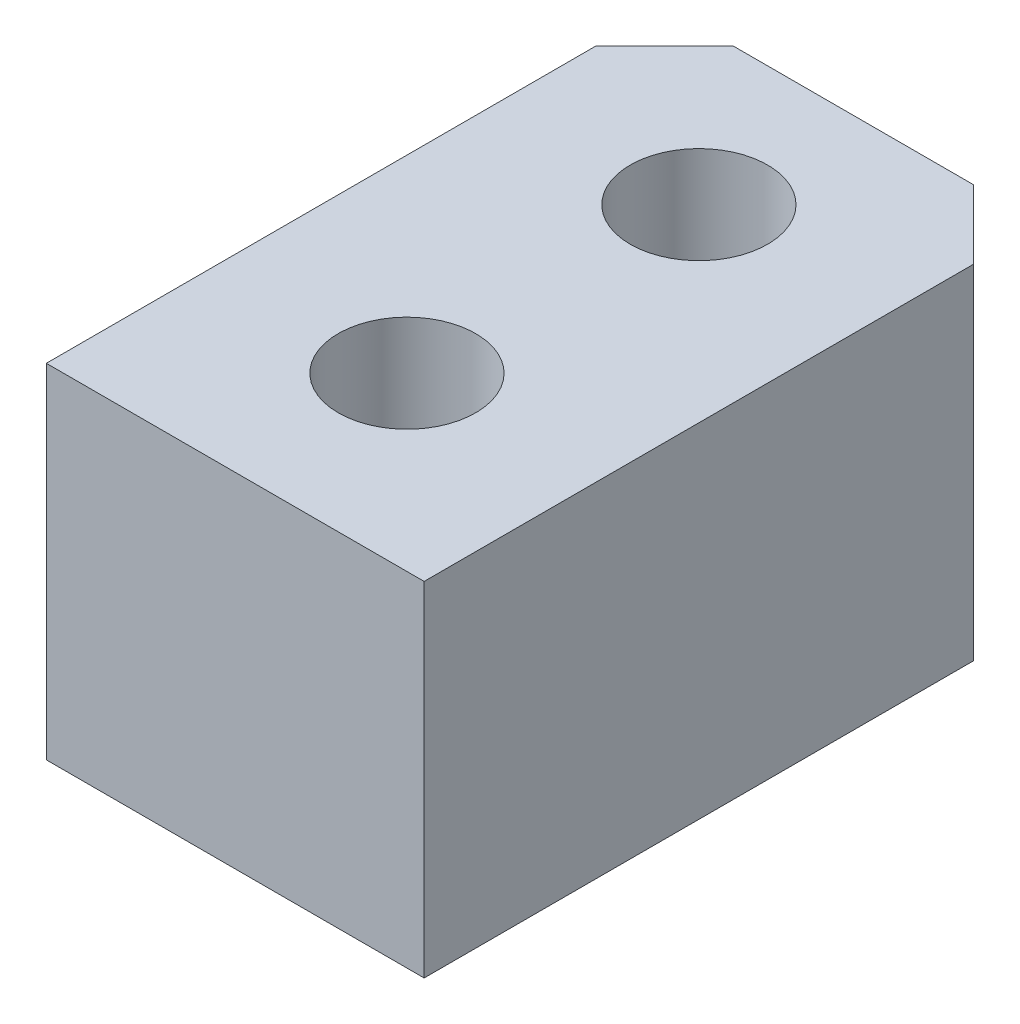
ISO-10303-21;
HEADER;
FILE_DESCRIPTION(('STEP AP214'),'2;1');
FILE_NAME('part.step','',(''),(''),'','','');
FILE_SCHEMA(('AUTOMOTIVE_DESIGN { 1 0 10303 214 1 1 1 1 }'));
ENDSEC;
DATA;
#1=APPLICATION_CONTEXT('core data for automotive mechanical design processes');
#2=APPLICATION_PROTOCOL_DEFINITION('international standard','automotive_design',2000,#1);
#3=PRODUCT_CONTEXT('',#1,'mechanical');
#4=PRODUCT('Part','Part','',(#3));
#5=PRODUCT_RELATED_PRODUCT_CATEGORY('part','',(#4));
#6=PRODUCT_DEFINITION_FORMATION('','',#4);
#7=PRODUCT_DEFINITION_CONTEXT('part definition',#1,'design');
#8=PRODUCT_DEFINITION('design','',#6,#7);
#9=PRODUCT_DEFINITION_SHAPE('','',#8);
#10=(LENGTH_UNIT() NAMED_UNIT(*) SI_UNIT(.MILLI.,.METRE.));
#11=(NAMED_UNIT(*) PLANE_ANGLE_UNIT() SI_UNIT($,.RADIAN.));
#12=(NAMED_UNIT(*) SI_UNIT($,.STERADIAN.) SOLID_ANGLE_UNIT());
#13=UNCERTAINTY_MEASURE_WITH_UNIT(LENGTH_MEASURE(1.E-05),#10,'distance_accuracy_value','');
#14=(GEOMETRIC_REPRESENTATION_CONTEXT(3) GLOBAL_UNCERTAINTY_ASSIGNED_CONTEXT((#13)) GLOBAL_UNIT_ASSIGNED_CONTEXT((#10,
#11,#12)) REPRESENTATION_CONTEXT('',''));
#15=CARTESIAN_POINT('',(0.,0.,0.));
#16=DIRECTION('',(0.,0.,1.));
#17=DIRECTION('',(1.,0.,0.));
#18=AXIS2_PLACEMENT_3D('',#15,#16,#17);
#19=CARTESIAN_POINT('',(0.,20.,0.));
#20=DIRECTION('',(0.,1.,0.));
#21=DIRECTION('',(0.,0.,1.));
#22=AXIS2_PLACEMENT_3D('',#19,#20,#21);
#23=PLANE('',#22);
#24=CARTESIAN_POINT('',(0.115789473684224,20.,7.60000000000001));
#25=DIRECTION('',(0.,1.,0.));
#26=DIRECTION('',(0.,0.,1.));
#27=AXIS2_PLACEMENT_3D('',#24,#25,#26);
#28=CIRCLE('',#27,4.);
#29=CARTESIAN_POINT('',(0.115789473684224,20.,11.6));
#30=VERTEX_POINT('',#29);
#31=EDGE_CURVE('E145',#30,#30,#28,.T.);
#32=ORIENTED_EDGE('',*,*,#31,.F.);
#33=EDGE_LOOP('',(#32));
#34=FACE_BOUND('',#33,.T.);
#35=DIRECTION('',(-1.,0.,0.));
#36=VECTOR('',#35,1.);
#37=CARTESIAN_POINT('',(-10.8842105263158,20.,-18.4));
#38=LINE('',#37,#36);
#39=CARTESIAN_POINT('',(7.11578947368423,20.,-18.4));
#40=VERTEX_POINT('',#39);
#41=CARTESIAN_POINT('',(-6.88421052631577,20.,-18.4));
#42=VERTEX_POINT('',#41);
#43=EDGE_CURVE('E117',#40,#42,#38,.T.);
#44=ORIENTED_EDGE('',*,*,#43,.T.);
#45=DIRECTION('',(0.707106781186548,0.,-0.707106781186547));
#46=VECTOR('',#45,1.);
#47=CARTESIAN_POINT('',(-12.6421052631579,20.,-12.6421052631579));
#48=LINE('',#47,#46);
#49=CARTESIAN_POINT('',(-10.8842105263158,20.,-14.4));
#50=VERTEX_POINT('',#49);
#51=EDGE_CURVE('E43',#42,#50,#48,.F.);
#52=ORIENTED_EDGE('',*,*,#51,.T.);
#53=DIRECTION('',(0.,0.,1.));
#54=VECTOR('',#53,1.);
#55=CARTESIAN_POINT('',(-10.8842105263158,20.,-18.4));
#56=LINE('',#55,#54);
#57=CARTESIAN_POINT('',(-10.8842105263158,20.,17.6));
#58=VERTEX_POINT('',#57);
#59=EDGE_CURVE('E89',#50,#58,#56,.T.);
#60=ORIENTED_EDGE('',*,*,#59,.T.);
#61=DIRECTION('',(1.,0.,0.));
#62=VECTOR('',#61,1.);
#63=CARTESIAN_POINT('',(-10.8842105263158,20.,17.6));
#64=LINE('',#63,#62);
#65=CARTESIAN_POINT('',(11.1157894736842,20.,17.6));
#66=VERTEX_POINT('',#65);
#67=EDGE_CURVE('E92',#58,#66,#64,.T.);
#68=ORIENTED_EDGE('',*,*,#67,.T.);
#69=DIRECTION('',(0.,0.,-1.));
#70=VECTOR('',#69,1.);
#71=CARTESIAN_POINT('',(11.1157894736842,20.,-18.4));
#72=LINE('',#71,#70);
#73=CARTESIAN_POINT('',(11.1157894736842,20.,-14.4));
#74=VERTEX_POINT('',#73);
#75=EDGE_CURVE('E107',#66,#74,#72,.T.);
#76=ORIENTED_EDGE('',*,*,#75,.T.);
#77=DIRECTION('',(0.707106781186546,0.,0.70710678118655));
#78=VECTOR('',#77,1.);
#79=CARTESIAN_POINT('',(12.7578947368421,20.,-12.7578947368421));
#80=LINE('',#79,#78);
#81=EDGE_CURVE('E128',#74,#40,#80,.F.);
#82=ORIENTED_EDGE('',*,*,#81,.T.);
#83=EDGE_LOOP('',(#44,#52,#60,#68,#76,#82));
#84=FACE_BOUND('',#83,.T.);
#85=CARTESIAN_POINT('',(0.115789473684224,20.,-9.39999999999999));
#86=DIRECTION('',(0.,1.,0.));
#87=DIRECTION('',(0.,0.,1.));
#88=AXIS2_PLACEMENT_3D('',#85,#86,#87);
#89=CIRCLE('',#88,4.);
#90=CARTESIAN_POINT('',(0.115789473684224,20.,-5.39999999999999));
#91=VERTEX_POINT('',#90);
#92=EDGE_CURVE('E151',#91,#91,#89,.T.);
#93=ORIENTED_EDGE('',*,*,#92,.F.);
#94=EDGE_LOOP('',(#93));
#95=FACE_BOUND('',#94,.T.);
#96=ADVANCED_FACE('F35',(#34,#84,#95),#23,.T.);
#97=CARTESIAN_POINT('',(0.,0.,0.));
#98=DIRECTION('',(0.,1.,0.));
#99=DIRECTION('',(0.,0.,1.));
#100=AXIS2_PLACEMENT_3D('',#97,#98,#99);
#101=PLANE('',#100);
#102=DIRECTION('',(0.,0.,1.));
#103=VECTOR('',#102,1.);
#104=CARTESIAN_POINT('',(-10.8842105263158,0.,-18.4));
#105=LINE('',#104,#103);
#106=CARTESIAN_POINT('',(-10.8842105263158,0.,-14.4));
#107=VERTEX_POINT('',#106);
#108=CARTESIAN_POINT('',(-10.8842105263158,0.,17.6));
#109=VERTEX_POINT('',#108);
#110=EDGE_CURVE('E111',#107,#109,#105,.T.);
#111=ORIENTED_EDGE('',*,*,#110,.F.);
#112=DIRECTION('',(-0.707106781186548,0.,0.707106781186547));
#113=VECTOR('',#112,1.);
#114=CARTESIAN_POINT('',(-10.8842105263158,0.,-14.4));
#115=LINE('',#114,#113);
#116=CARTESIAN_POINT('',(-6.88421052631577,0.,-18.4));
#117=VERTEX_POINT('',#116);
#118=EDGE_CURVE('E122',#107,#117,#115,.F.);
#119=ORIENTED_EDGE('',*,*,#118,.T.);
#120=DIRECTION('',(-1.,0.,0.));
#121=VECTOR('',#120,1.);
#122=CARTESIAN_POINT('',(-10.8842105263158,0.,-18.4));
#123=LINE('',#122,#121);
#124=CARTESIAN_POINT('',(7.11578947368423,0.,-18.4));
#125=VERTEX_POINT('',#124);
#126=EDGE_CURVE('E99',#125,#117,#123,.T.);
#127=ORIENTED_EDGE('',*,*,#126,.F.);
#128=DIRECTION('',(-0.707106781186546,0.,-0.70710678118655));
#129=VECTOR('',#128,1.);
#130=CARTESIAN_POINT('',(7.11578947368423,0.,-18.4));
#131=LINE('',#130,#129);
#132=CARTESIAN_POINT('',(11.1157894736842,0.,-14.4));
#133=VERTEX_POINT('',#132);
#134=EDGE_CURVE('E115',#125,#133,#131,.F.);
#135=ORIENTED_EDGE('',*,*,#134,.T.);
#136=DIRECTION('',(0.,0.,-1.));
#137=VECTOR('',#136,1.);
#138=CARTESIAN_POINT('',(11.1157894736842,0.,-18.4));
#139=LINE('',#138,#137);
#140=CARTESIAN_POINT('',(11.1157894736842,0.,17.6));
#141=VERTEX_POINT('',#140);
#142=EDGE_CURVE('E139',#141,#133,#139,.T.);
#143=ORIENTED_EDGE('',*,*,#142,.F.);
#144=DIRECTION('',(1.,0.,0.));
#145=VECTOR('',#144,1.);
#146=CARTESIAN_POINT('',(-10.8842105263158,0.,17.6));
#147=LINE('',#146,#145);
#148=EDGE_CURVE('E141',#109,#141,#147,.T.);
#149=ORIENTED_EDGE('',*,*,#148,.F.);
#150=EDGE_LOOP('',(#111,#119,#127,#135,#143,#149));
#151=FACE_BOUND('',#150,.T.);
#152=CARTESIAN_POINT('',(0.115789473684224,0.,7.60000000000001));
#153=DIRECTION('',(0.,1.,0.));
#154=DIRECTION('',(0.,0.,1.));
#155=AXIS2_PLACEMENT_3D('',#152,#153,#154);
#156=CIRCLE('',#155,4.);
#157=CARTESIAN_POINT('',(0.115789473684224,0.,11.6));
#158=VERTEX_POINT('',#157);
#159=EDGE_CURVE('E148',#158,#158,#156,.T.);
#160=ORIENTED_EDGE('',*,*,#159,.T.);
#161=EDGE_LOOP('',(#160));
#162=FACE_BOUND('',#161,.T.);
#163=CARTESIAN_POINT('',(0.115789473684224,0.,-9.39999999999999));
#164=DIRECTION('',(0.,1.,0.));
#165=DIRECTION('',(0.,0.,1.));
#166=AXIS2_PLACEMENT_3D('',#163,#164,#165);
#167=CIRCLE('',#166,4.);
#168=CARTESIAN_POINT('',(0.115789473684224,0.,-5.39999999999999));
#169=VERTEX_POINT('',#168);
#170=EDGE_CURVE('E154',#169,#169,#167,.T.);
#171=ORIENTED_EDGE('',*,*,#170,.T.);
#172=EDGE_LOOP('',(#171));
#173=FACE_BOUND('',#172,.T.);
#174=ADVANCED_FACE('F137',(#151,#162,#173),#101,.F.);
#175=CARTESIAN_POINT('',(-10.8842105263158,20.,-18.4));
#176=DIRECTION('',(1.,0.,0.));
#177=DIRECTION('',(0.,0.,-1.));
#178=AXIS2_PLACEMENT_3D('',#175,#176,#177);
#179=PLANE('',#178);
#180=ORIENTED_EDGE('',*,*,#59,.F.);
#181=DIRECTION('',(0.,-1.,0.));
#182=VECTOR('',#181,1.);
#183=CARTESIAN_POINT('',(-10.8842105263158,20.,-14.4));
#184=LINE('',#183,#182);
#185=EDGE_CURVE('E113',#50,#107,#184,.T.);
#186=ORIENTED_EDGE('',*,*,#185,.T.);
#187=ORIENTED_EDGE('',*,*,#110,.T.);
#188=DIRECTION('',(0.,-1.,0.));
#189=VECTOR('',#188,1.);
#190=CARTESIAN_POINT('',(-10.8842105263158,20.,17.6));
#191=LINE('',#190,#189);
#192=EDGE_CURVE('E104',#58,#109,#191,.T.);
#193=ORIENTED_EDGE('',*,*,#192,.F.);
#194=EDGE_LOOP('',(#180,#186,#187,#193));
#195=FACE_BOUND('',#194,.T.);
#196=ADVANCED_FACE('F109',(#195),#179,.F.);
#197=CARTESIAN_POINT('',(-10.8842105263158,20.,17.6));
#198=DIRECTION('',(0.,0.,-1.));
#199=DIRECTION('',(-1.,0.,0.));
#200=AXIS2_PLACEMENT_3D('',#197,#198,#199);
#201=PLANE('',#200);
#202=ORIENTED_EDGE('',*,*,#148,.T.);
#203=DIRECTION('',(0.,-1.,0.));
#204=VECTOR('',#203,1.);
#205=CARTESIAN_POINT('',(11.1157894736842,20.,17.6));
#206=LINE('',#205,#204);
#207=EDGE_CURVE('E106',#66,#141,#206,.T.);
#208=ORIENTED_EDGE('',*,*,#207,.F.);
#209=ORIENTED_EDGE('',*,*,#67,.F.);
#210=ORIENTED_EDGE('',*,*,#192,.T.);
#211=EDGE_LOOP('',(#202,#208,#209,#210));
#212=FACE_BOUND('',#211,.T.);
#213=ADVANCED_FACE('F103',(#212),#201,.F.);
#214=CARTESIAN_POINT('',(11.1157894736842,20.,-18.4));
#215=DIRECTION('',(-1.,0.,0.));
#216=DIRECTION('',(0.,0.,1.));
#217=AXIS2_PLACEMENT_3D('',#214,#215,#216);
#218=PLANE('',#217);
#219=ORIENTED_EDGE('',*,*,#142,.T.);
#220=DIRECTION('',(0.,1.,0.));
#221=VECTOR('',#220,1.);
#222=CARTESIAN_POINT('',(11.1157894736842,20.,-14.4));
#223=LINE('',#222,#221);
#224=EDGE_CURVE('E11',#133,#74,#223,.T.);
#225=ORIENTED_EDGE('',*,*,#224,.T.);
#226=ORIENTED_EDGE('',*,*,#75,.F.);
#227=ORIENTED_EDGE('',*,*,#207,.T.);
#228=EDGE_LOOP('',(#219,#225,#226,#227));
#229=FACE_BOUND('',#228,.T.);
#230=ADVANCED_FACE('F140',(#229),#218,.F.);
#231=CARTESIAN_POINT('',(-10.8842105263158,20.,-18.4));
#232=DIRECTION('',(0.,0.,1.));
#233=DIRECTION('',(1.,0.,0.));
#234=AXIS2_PLACEMENT_3D('',#231,#232,#233);
#235=PLANE('',#234);
#236=ORIENTED_EDGE('',*,*,#126,.T.);
#237=DIRECTION('',(0.,1.,0.));
#238=VECTOR('',#237,1.);
#239=CARTESIAN_POINT('',(-6.88421052631577,20.,-18.4));
#240=LINE('',#239,#238);
#241=EDGE_CURVE('E56',#117,#42,#240,.T.);
#242=ORIENTED_EDGE('',*,*,#241,.T.);
#243=ORIENTED_EDGE('',*,*,#43,.F.);
#244=DIRECTION('',(0.,-1.,0.));
#245=VECTOR('',#244,1.);
#246=CARTESIAN_POINT('',(7.11578947368423,20.,-18.4));
#247=LINE('',#246,#245);
#248=EDGE_CURVE('E124',#40,#125,#247,.T.);
#249=ORIENTED_EDGE('',*,*,#248,.T.);
#250=EDGE_LOOP('',(#236,#242,#243,#249));
#251=FACE_BOUND('',#250,.T.);
#252=ADVANCED_FACE('F132',(#251),#235,.F.);
#253=CARTESIAN_POINT('',(0.115789473684224,20.,7.60000000000001));
#254=DIRECTION('',(0.,-1.,0.));
#255=DIRECTION('',(0.,0.,-1.));
#256=AXIS2_PLACEMENT_3D('',#253,#254,#255);
#257=CYLINDRICAL_SURFACE('',#256,4.);
#258=ORIENTED_EDGE('',*,*,#31,.T.);
#259=EDGE_LOOP('',(#258));
#260=FACE_BOUND('',#259,.T.);
#261=ORIENTED_EDGE('',*,*,#159,.F.);
#262=EDGE_LOOP('',(#261));
#263=FACE_BOUND('',#262,.T.);
#264=ADVANCED_FACE('F171',(#260,#263),#257,.F.);
#265=CARTESIAN_POINT('',(0.115789473684224,20.,-9.39999999999999));
#266=DIRECTION('',(0.,-1.,0.));
#267=DIRECTION('',(0.,0.,-1.));
#268=AXIS2_PLACEMENT_3D('',#265,#266,#267);
#269=CYLINDRICAL_SURFACE('',#268,4.);
#270=ORIENTED_EDGE('',*,*,#92,.T.);
#271=EDGE_LOOP('',(#270));
#272=FACE_BOUND('',#271,.T.);
#273=ORIENTED_EDGE('',*,*,#170,.F.);
#274=EDGE_LOOP('',(#273));
#275=FACE_BOUND('',#274,.T.);
#276=ADVANCED_FACE('F160',(#272,#275),#269,.F.);
#277=CARTESIAN_POINT('',(-10.8842105263158,20.,-14.4));
#278=DIRECTION('',(0.707106781186547,0.,0.707106781186548));
#279=DIRECTION('',(0.,-1.,0.));
#280=AXIS2_PLACEMENT_3D('',#277,#278,#279);
#281=PLANE('',#280);
#282=ORIENTED_EDGE('',*,*,#51,.F.);
#283=ORIENTED_EDGE('',*,*,#241,.F.);
#284=ORIENTED_EDGE('',*,*,#118,.F.);
#285=ORIENTED_EDGE('',*,*,#185,.F.);
#286=EDGE_LOOP('',(#282,#283,#284,#285));
#287=FACE_BOUND('',#286,.T.);
#288=ADVANCED_FACE('F181',(#287),#281,.F.);
#289=CARTESIAN_POINT('',(7.11578947368423,20.,-18.4));
#290=DIRECTION('',(-0.707106781186549,0.,0.707106781186545));
#291=DIRECTION('',(0.,-1.,0.));
#292=AXIS2_PLACEMENT_3D('',#289,#290,#291);
#293=PLANE('',#292);
#294=ORIENTED_EDGE('',*,*,#81,.F.);
#295=ORIENTED_EDGE('',*,*,#224,.F.);
#296=ORIENTED_EDGE('',*,*,#134,.F.);
#297=ORIENTED_EDGE('',*,*,#248,.F.);
#298=EDGE_LOOP('',(#294,#295,#296,#297));
#299=FACE_BOUND('',#298,.T.);
#300=ADVANCED_FACE('F37',(#299),#293,.F.);
#301=CLOSED_SHELL('',(#96,#174,#196,#213,#230,#252,#264,#276,#288,#300));
#302=MANIFOLD_SOLID_BREP('B2',#301);
#303=ADVANCED_BREP_SHAPE_REPRESENTATION('',(#18,#302),#14);
#304=SHAPE_DEFINITION_REPRESENTATION(#9,#303);
ENDSEC;
END-ISO-10303-21;
